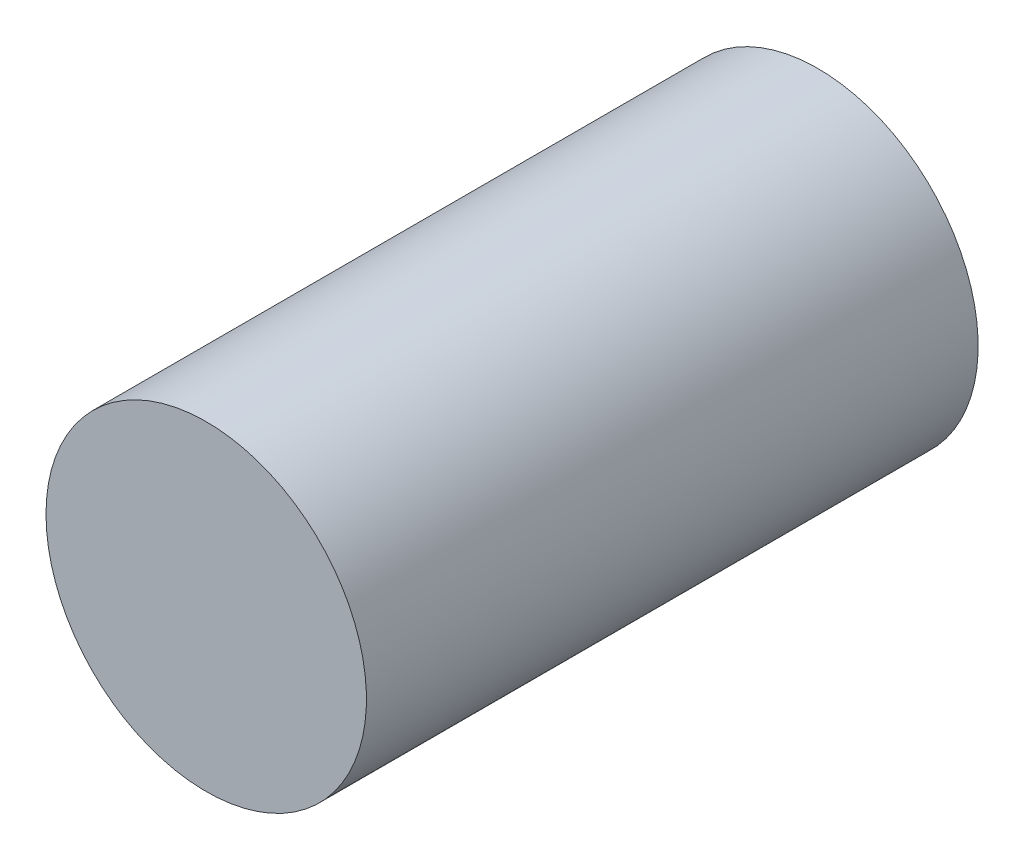
ISO-10303-21;
HEADER;
FILE_DESCRIPTION(('STEP AP214'),'2;1');
FILE_NAME('part.step','',(''),(''),'','','');
FILE_SCHEMA(('AUTOMOTIVE_DESIGN { 1 0 10303 214 1 1 1 1 }'));
ENDSEC;
DATA;
#1=APPLICATION_CONTEXT('core data for automotive mechanical design processes');
#2=APPLICATION_PROTOCOL_DEFINITION('international standard','automotive_design',2000,#1);
#3=PRODUCT_CONTEXT('',#1,'mechanical');
#4=PRODUCT('Part','Part','',(#3));
#5=PRODUCT_RELATED_PRODUCT_CATEGORY('part','',(#4));
#6=PRODUCT_DEFINITION_FORMATION('','',#4);
#7=PRODUCT_DEFINITION_CONTEXT('part definition',#1,'design');
#8=PRODUCT_DEFINITION('design','',#6,#7);
#9=PRODUCT_DEFINITION_SHAPE('','',#8);
#10=(LENGTH_UNIT() NAMED_UNIT(*) SI_UNIT(.MILLI.,.METRE.));
#11=(NAMED_UNIT(*) PLANE_ANGLE_UNIT() SI_UNIT($,.RADIAN.));
#12=(NAMED_UNIT(*) SI_UNIT($,.STERADIAN.) SOLID_ANGLE_UNIT());
#13=UNCERTAINTY_MEASURE_WITH_UNIT(LENGTH_MEASURE(1.E-05),#10,'distance_accuracy_value','');
#14=(GEOMETRIC_REPRESENTATION_CONTEXT(3) GLOBAL_UNCERTAINTY_ASSIGNED_CONTEXT((#13)) GLOBAL_UNIT_ASSIGNED_CONTEXT((#10,
#11,#12)) REPRESENTATION_CONTEXT('',''));
#15=CARTESIAN_POINT('',(0.,0.,0.));
#16=DIRECTION('',(0.,0.,1.));
#17=DIRECTION('',(1.,0.,0.));
#18=AXIS2_PLACEMENT_3D('',#15,#16,#17);
#19=CARTESIAN_POINT('',(0.,0.,21.));
#20=DIRECTION('',(0.,0.,-1.));
#21=DIRECTION('',(-1.,0.,0.));
#22=AXIS2_PLACEMENT_3D('',#19,#20,#21);
#23=CYLINDRICAL_SURFACE('',#22,5.5);
#24=CARTESIAN_POINT('',(0.,0.,21.));
#25=DIRECTION('',(0.,0.,1.));
#26=DIRECTION('',(1.,0.,0.));
#27=AXIS2_PLACEMENT_3D('',#24,#25,#26);
#28=CIRCLE('',#27,5.5);
#29=CARTESIAN_POINT('',(-5.5,0.,21.));
#30=VERTEX_POINT('',#29);
#31=EDGE_CURVE('E10',#30,#30,#28,.T.);
#32=CARTESIAN_POINT('',(0.,0.,0.));
#33=DIRECTION('',(0.,0.,1.));
#34=DIRECTION('',(1.,0.,0.));
#35=AXIS2_PLACEMENT_3D('',#32,#33,#34);
#36=CIRCLE('',#35,5.5);
#37=CARTESIAN_POINT('',(-5.5,0.,0.));
#38=VERTEX_POINT('',#37);
#39=EDGE_CURVE('E44',#38,#38,#36,.T.);
#40=CARTESIAN_POINT('',(-5.5,0.,21.));
#41=CARTESIAN_POINT('',(-5.5,0.,20.78125));
#42=CARTESIAN_POINT('',(-5.5,0.,20.5625));
#43=CARTESIAN_POINT('',(-5.5,0.,20.125));
#44=CARTESIAN_POINT('',(-5.5,0.,19.90625));
#45=CARTESIAN_POINT('',(-5.5,0.,19.46875));
#46=CARTESIAN_POINT('',(-5.5,0.,19.25));
#47=CARTESIAN_POINT('',(-5.5,0.,18.8125));
#48=CARTESIAN_POINT('',(-5.5,0.,18.59375));
#49=CARTESIAN_POINT('',(-5.5,0.,18.15625));
#50=CARTESIAN_POINT('',(-5.5,0.,17.9375));
#51=CARTESIAN_POINT('',(-5.5,0.,17.5));
#52=CARTESIAN_POINT('',(-5.5,0.,17.28125));
#53=CARTESIAN_POINT('',(-5.5,0.,16.84375));
#54=CARTESIAN_POINT('',(-5.5,0.,16.625));
#55=CARTESIAN_POINT('',(-5.5,0.,16.1875));
#56=CARTESIAN_POINT('',(-5.5,0.,15.96875));
#57=CARTESIAN_POINT('',(-5.5,0.,15.53125));
#58=CARTESIAN_POINT('',(-5.5,0.,15.3125));
#59=CARTESIAN_POINT('',(-5.5,0.,14.875));
#60=CARTESIAN_POINT('',(-5.5,0.,14.65625));
#61=CARTESIAN_POINT('',(-5.5,0.,14.21875));
#62=CARTESIAN_POINT('',(-5.5,0.,14.));
#63=CARTESIAN_POINT('',(-5.5,0.,13.5625));
#64=CARTESIAN_POINT('',(-5.5,0.,13.34375));
#65=CARTESIAN_POINT('',(-5.5,0.,12.90625));
#66=CARTESIAN_POINT('',(-5.5,0.,12.6875));
#67=CARTESIAN_POINT('',(-5.5,0.,12.25));
#68=CARTESIAN_POINT('',(-5.5,0.,12.03125));
#69=CARTESIAN_POINT('',(-5.5,0.,11.59375));
#70=CARTESIAN_POINT('',(-5.5,0.,11.375));
#71=CARTESIAN_POINT('',(-5.5,0.,10.9375));
#72=CARTESIAN_POINT('',(-5.5,0.,10.71875));
#73=CARTESIAN_POINT('',(-5.5,0.,10.28125));
#74=CARTESIAN_POINT('',(-5.5,0.,10.0625));
#75=CARTESIAN_POINT('',(-5.5,0.,9.625));
#76=CARTESIAN_POINT('',(-5.5,0.,9.40625));
#77=CARTESIAN_POINT('',(-5.5,0.,8.96875));
#78=CARTESIAN_POINT('',(-5.5,0.,8.75));
#79=CARTESIAN_POINT('',(-5.5,0.,8.3125));
#80=CARTESIAN_POINT('',(-5.5,0.,8.09375));
#81=CARTESIAN_POINT('',(-5.5,0.,7.65625));
#82=CARTESIAN_POINT('',(-5.5,0.,7.4375));
#83=CARTESIAN_POINT('',(-5.5,0.,7.));
#84=CARTESIAN_POINT('',(-5.5,0.,6.78125));
#85=CARTESIAN_POINT('',(-5.5,0.,6.34375));
#86=CARTESIAN_POINT('',(-5.5,0.,6.125));
#87=CARTESIAN_POINT('',(-5.5,0.,5.6875));
#88=CARTESIAN_POINT('',(-5.5,0.,5.46875));
#89=CARTESIAN_POINT('',(-5.5,0.,5.03125));
#90=CARTESIAN_POINT('',(-5.5,0.,4.8125));
#91=CARTESIAN_POINT('',(-5.5,0.,4.375));
#92=CARTESIAN_POINT('',(-5.5,0.,4.15625));
#93=CARTESIAN_POINT('',(-5.5,0.,3.71875));
#94=CARTESIAN_POINT('',(-5.5,0.,3.5));
#95=CARTESIAN_POINT('',(-5.5,0.,3.0625));
#96=CARTESIAN_POINT('',(-5.5,0.,2.84375));
#97=CARTESIAN_POINT('',(-5.5,0.,2.40625));
#98=CARTESIAN_POINT('',(-5.5,0.,2.1875));
#99=CARTESIAN_POINT('',(-5.5,0.,1.75));
#100=CARTESIAN_POINT('',(-5.5,0.,1.53125));
#101=CARTESIAN_POINT('',(-5.5,0.,1.09375));
#102=CARTESIAN_POINT('',(-5.5,0.,0.875000000000001));
#103=CARTESIAN_POINT('',(-5.5,0.,0.4375));
#104=CARTESIAN_POINT('',(-5.5,0.,0.21875));
#105=CARTESIAN_POINT('',(-5.5,0.,0.));
#106=B_SPLINE_CURVE_WITH_KNOTS('',3,(#40,#41,#42,#43,#44,#45,#46,#47,#48,#49,#50,#51,#52,#53,
#54,#55,#56,#57,#58,#59,#60,#61,#62,#63,#64,#65,#66,#67,#68,#69,#70,#71,#72,#73,#74,#75,#76,#77,
#78,#79,#80,#81,#82,#83,#84,#85,#86,#87,#88,#89,#90,#91,#92,#93,#94,#95,#96,#97,#98,#99,#100,
#101,#102,#103,#104,#105),.UNSPECIFIED.,.F.,.F.,(4,2,2,2,2,2,2,2,2,2,2,2,2,2,2,2,2,2,2,2,2,2,2,
2,2,2,2,2,2,2,2,2,4),(0.,0.656250000000001,1.3125,1.96875,2.625,3.28125,3.9375,4.59375,5.25,
5.90625,6.5625,7.21875,7.875,8.53125,9.1875,9.84375,10.5,11.15625,11.8125,12.46875,13.125,
13.78125,14.4375,15.09375,15.75,16.40625,17.0625,17.71875,18.375,19.03125,19.6875,20.34375,21.),.UNSPECIFIED.);
#107=EDGE_CURVE('BSEAM41',#30,#38,#106,.T.);
#108=ORIENTED_EDGE('',*,*,#31,.F.);
#109=ORIENTED_EDGE('',*,*,#39,.T.);
#110=ORIENTED_EDGE('',*,*,#107,.T.);
#111=ORIENTED_EDGE('',*,*,#107,.F.);
#112=EDGE_LOOP('',(#108,#110,#109,#111));
#113=FACE_BOUND('',#112,.T.);
#114=ADVANCED_FACE('F41',(#113),#23,.T.);
#115=CARTESIAN_POINT('',(0.,0.,21.));
#116=DIRECTION('',(0.,0.,1.));
#117=DIRECTION('',(1.,0.,0.));
#118=AXIS2_PLACEMENT_3D('',#115,#116,#117);
#119=PLANE('',#118);
#120=ORIENTED_EDGE('',*,*,#31,.T.);
#121=EDGE_LOOP('',(#120));
#122=FACE_BOUND('',#121,.T.);
#123=ADVANCED_FACE('F58',(#122),#119,.T.);
#124=CARTESIAN_POINT('',(0.,0.,0.));
#125=DIRECTION('',(0.,0.,1.));
#126=DIRECTION('',(1.,0.,0.));
#127=AXIS2_PLACEMENT_3D('',#124,#125,#126);
#128=PLANE('',#127);
#129=ORIENTED_EDGE('',*,*,#39,.F.);
#130=EDGE_LOOP('',(#129));
#131=FACE_BOUND('',#130,.T.);
#132=ADVANCED_FACE('F56',(#131),#128,.F.);
#133=CLOSED_SHELL('',(#114,#123,#132));
#134=MANIFOLD_SOLID_BREP('B2',#133);
#135=ADVANCED_BREP_SHAPE_REPRESENTATION('',(#18,#134),#14);
#136=SHAPE_DEFINITION_REPRESENTATION(#9,#135);
ENDSEC;
END-ISO-10303-21;
